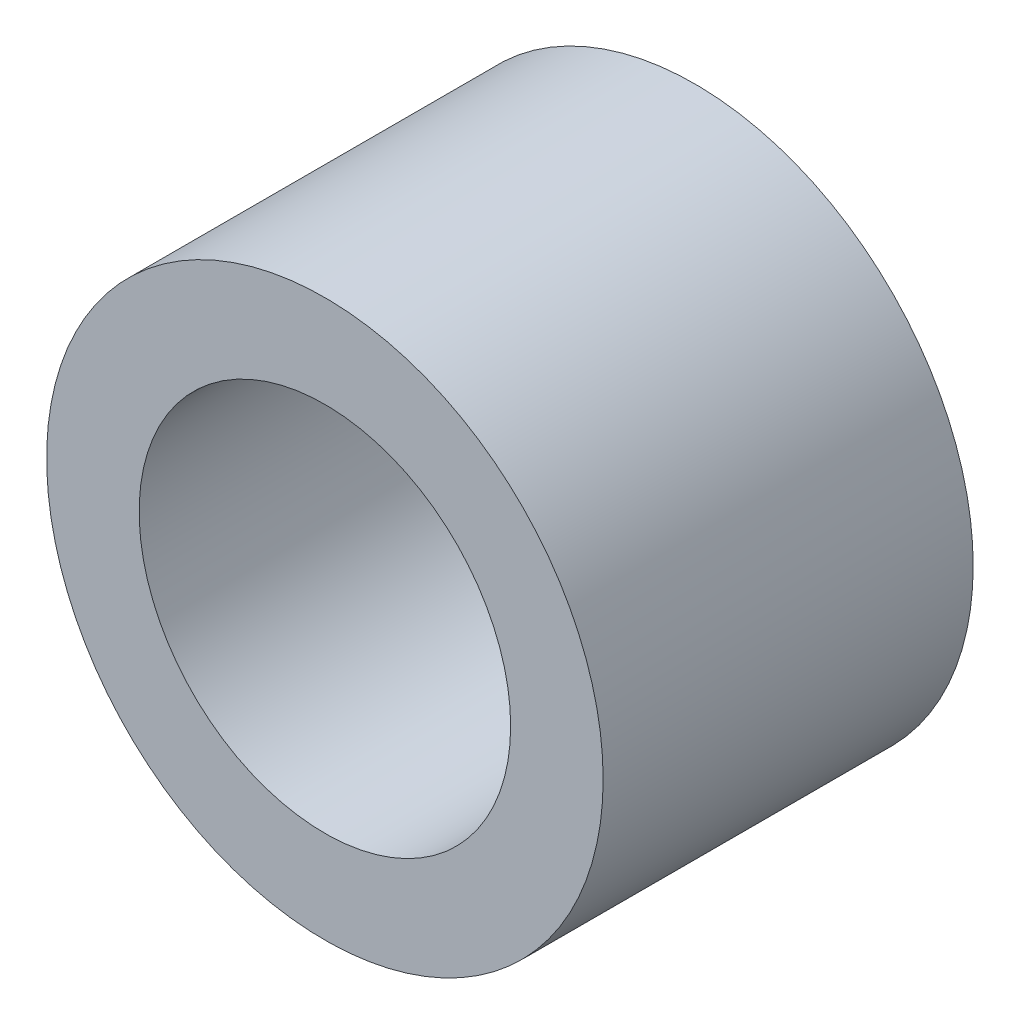
ISO-10303-21;
HEADER;
FILE_DESCRIPTION(('STEP AP214'),'2;1');
FILE_NAME('part.step','',(''),(''),'','','');
FILE_SCHEMA(('AUTOMOTIVE_DESIGN { 1 0 10303 214 1 1 1 1 }'));
ENDSEC;
DATA;
#1=APPLICATION_CONTEXT('core data for automotive mechanical design processes');
#2=APPLICATION_PROTOCOL_DEFINITION('international standard','automotive_design',2000,#1);
#3=PRODUCT_CONTEXT('',#1,'mechanical');
#4=PRODUCT('Part','Part','',(#3));
#5=PRODUCT_RELATED_PRODUCT_CATEGORY('part','',(#4));
#6=PRODUCT_DEFINITION_FORMATION('','',#4);
#7=PRODUCT_DEFINITION_CONTEXT('part definition',#1,'design');
#8=PRODUCT_DEFINITION('design','',#6,#7);
#9=PRODUCT_DEFINITION_SHAPE('','',#8);
#10=(LENGTH_UNIT() NAMED_UNIT(*) SI_UNIT(.MILLI.,.METRE.));
#11=(NAMED_UNIT(*) PLANE_ANGLE_UNIT() SI_UNIT($,.RADIAN.));
#12=(NAMED_UNIT(*) SI_UNIT($,.STERADIAN.) SOLID_ANGLE_UNIT());
#13=UNCERTAINTY_MEASURE_WITH_UNIT(LENGTH_MEASURE(1.E-05),#10,'distance_accuracy_value','');
#14=(GEOMETRIC_REPRESENTATION_CONTEXT(3) GLOBAL_UNCERTAINTY_ASSIGNED_CONTEXT((#13)) GLOBAL_UNIT_ASSIGNED_CONTEXT((#10,
#11,#12)) REPRESENTATION_CONTEXT('',''));
#15=CARTESIAN_POINT('',(0.,0.,0.));
#16=DIRECTION('',(0.,0.,1.));
#17=DIRECTION('',(1.,0.,0.));
#18=AXIS2_PLACEMENT_3D('',#15,#16,#17);
#19=CARTESIAN_POINT('',(0.,0.,3.175));
#20=DIRECTION('',(0.,0.,1.));
#21=DIRECTION('',(1.,0.,0.));
#22=AXIS2_PLACEMENT_3D('',#19,#20,#21);
#23=PLANE('',#22);
#24=CARTESIAN_POINT('',(0.,0.,3.175));
#25=DIRECTION('',(0.,0.,1.));
#26=DIRECTION('',(1.,0.,0.));
#27=AXIS2_PLACEMENT_3D('',#24,#25,#26);
#28=CIRCLE('',#27,4.7752);
#29=CARTESIAN_POINT('',(4.7752,0.,3.175));
#30=VERTEX_POINT('',#29);
#31=EDGE_CURVE('E10',#30,#30,#28,.T.);
#32=ORIENTED_EDGE('',*,*,#31,.T.);
#33=EDGE_LOOP('',(#32));
#34=FACE_BOUND('',#33,.T.);
#35=CARTESIAN_POINT('',(0.,0.,3.175));
#36=DIRECTION('',(0.,0.,1.));
#37=DIRECTION('',(1.,0.,0.));
#38=AXIS2_PLACEMENT_3D('',#35,#36,#37);
#39=CIRCLE('',#38,3.1877);
#40=CARTESIAN_POINT('',(3.1877,0.,3.175));
#41=VERTEX_POINT('',#40);
#42=EDGE_CURVE('E47',#41,#41,#39,.T.);
#43=ORIENTED_EDGE('',*,*,#42,.F.);
#44=EDGE_LOOP('',(#43));
#45=FACE_BOUND('',#44,.T.);
#46=ADVANCED_FACE('F41',(#34,#45),#23,.T.);
#47=CARTESIAN_POINT('',(0.,0.,3.175));
#48=DIRECTION('',(0.,0.,-1.));
#49=DIRECTION('',(-1.,0.,0.));
#50=AXIS2_PLACEMENT_3D('',#47,#48,#49);
#51=CYLINDRICAL_SURFACE('',#50,4.7752);
#52=ORIENTED_EDGE('',*,*,#31,.F.);
#53=EDGE_LOOP('',(#52));
#54=FACE_BOUND('',#53,.T.);
#55=CARTESIAN_POINT('',(0.,0.,-3.175));
#56=DIRECTION('',(0.,0.,1.));
#57=DIRECTION('',(1.,0.,0.));
#58=AXIS2_PLACEMENT_3D('',#55,#56,#57);
#59=CIRCLE('',#58,4.7752);
#60=CARTESIAN_POINT('',(4.7752,0.,-3.175));
#61=VERTEX_POINT('',#60);
#62=EDGE_CURVE('E54',#61,#61,#59,.T.);
#63=ORIENTED_EDGE('',*,*,#62,.T.);
#64=EDGE_LOOP('',(#63));
#65=FACE_BOUND('',#64,.T.);
#66=ADVANCED_FACE('F43',(#54,#65),#51,.T.);
#67=CARTESIAN_POINT('',(0.,0.,3.175));
#68=DIRECTION('',(0.,0.,-1.));
#69=DIRECTION('',(-1.,0.,0.));
#70=AXIS2_PLACEMENT_3D('',#67,#68,#69);
#71=CYLINDRICAL_SURFACE('',#70,3.1877);
#72=ORIENTED_EDGE('',*,*,#42,.T.);
#73=EDGE_LOOP('',(#72));
#74=FACE_BOUND('',#73,.T.);
#75=CARTESIAN_POINT('',(0.,0.,-3.175));
#76=DIRECTION('',(0.,0.,1.));
#77=DIRECTION('',(1.,0.,0.));
#78=AXIS2_PLACEMENT_3D('',#75,#76,#77);
#79=CIRCLE('',#78,3.1877);
#80=CARTESIAN_POINT('',(3.1877,0.,-3.175));
#81=VERTEX_POINT('',#80);
#82=EDGE_CURVE('E62',#81,#81,#79,.T.);
#83=ORIENTED_EDGE('',*,*,#82,.F.);
#84=EDGE_LOOP('',(#83));
#85=FACE_BOUND('',#84,.T.);
#86=ADVANCED_FACE('F75',(#74,#85),#71,.F.);
#87=CARTESIAN_POINT('',(0.,0.,-3.175));
#88=DIRECTION('',(0.,0.,1.));
#89=DIRECTION('',(1.,0.,0.));
#90=AXIS2_PLACEMENT_3D('',#87,#88,#89);
#91=PLANE('',#90);
#92=ORIENTED_EDGE('',*,*,#82,.T.);
#93=EDGE_LOOP('',(#92));
#94=FACE_BOUND('',#93,.T.);
#95=ORIENTED_EDGE('',*,*,#62,.F.);
#96=EDGE_LOOP('',(#95));
#97=FACE_BOUND('',#96,.T.);
#98=ADVANCED_FACE('F66',(#94,#97),#91,.F.);
#99=CLOSED_SHELL('',(#46,#66,#86,#98));
#100=MANIFOLD_SOLID_BREP('B2',#99);
#101=ADVANCED_BREP_SHAPE_REPRESENTATION('',(#18,#100),#14);
#102=SHAPE_DEFINITION_REPRESENTATION(#9,#101);
ENDSEC;
END-ISO-10303-21;
